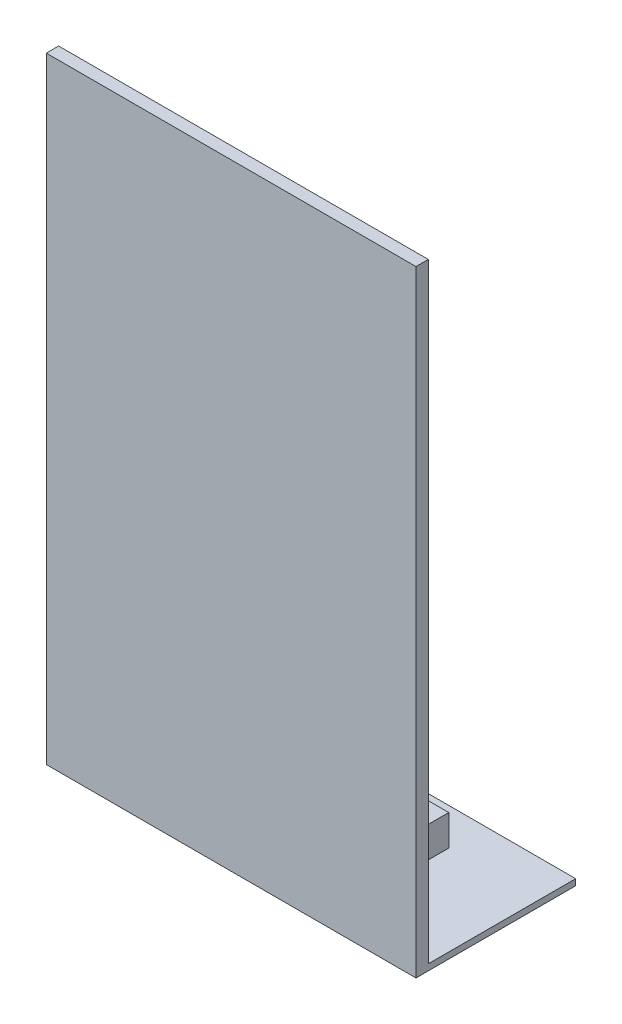
ISO-10303-21;
HEADER;
FILE_DESCRIPTION(('STEP AP214'),'2;1');
FILE_NAME('part.step','',(''),(''),'','','');
FILE_SCHEMA(('AUTOMOTIVE_DESIGN { 1 0 10303 214 1 1 1 1 }'));
ENDSEC;
DATA;
#1=APPLICATION_CONTEXT('core data for automotive mechanical design processes');
#2=APPLICATION_PROTOCOL_DEFINITION('international standard','automotive_design',2000,#1);
#3=PRODUCT_CONTEXT('',#1,'mechanical');
#4=PRODUCT('Part','Part','',(#3));
#5=PRODUCT_RELATED_PRODUCT_CATEGORY('part','',(#4));
#6=PRODUCT_DEFINITION_FORMATION('','',#4);
#7=PRODUCT_DEFINITION_CONTEXT('part definition',#1,'design');
#8=PRODUCT_DEFINITION('design','',#6,#7);
#9=PRODUCT_DEFINITION_SHAPE('','',#8);
#10=(LENGTH_UNIT() NAMED_UNIT(*) SI_UNIT(.MILLI.,.METRE.));
#11=(NAMED_UNIT(*) PLANE_ANGLE_UNIT() SI_UNIT($,.RADIAN.));
#12=(NAMED_UNIT(*) SI_UNIT($,.STERADIAN.) SOLID_ANGLE_UNIT());
#13=UNCERTAINTY_MEASURE_WITH_UNIT(LENGTH_MEASURE(1.E-05),#10,'distance_accuracy_value','');
#14=(GEOMETRIC_REPRESENTATION_CONTEXT(3) GLOBAL_UNCERTAINTY_ASSIGNED_CONTEXT((#13)) GLOBAL_UNIT_ASSIGNED_CONTEXT((#10,
#11,#12)) REPRESENTATION_CONTEXT('',''));
#15=CARTESIAN_POINT('',(0.,0.,0.));
#16=DIRECTION('',(0.,0.,1.));
#17=DIRECTION('',(1.,0.,0.));
#18=AXIS2_PLACEMENT_3D('',#15,#16,#17);
#19=CARTESIAN_POINT('',(0.,5.,0.));
#20=DIRECTION('',(0.,1.,0.));
#21=DIRECTION('',(0.,0.,1.));
#22=AXIS2_PLACEMENT_3D('',#19,#20,#21);
#23=PLANE('',#22);
#24=DIRECTION('',(0.,0.,1.));
#25=VECTOR('',#24,1.);
#26=CARTESIAN_POINT('',(-150.,5.,176.));
#27=LINE('',#26,#25);
#28=CARTESIAN_POINT('',(-150.,5.,176.));
#29=VERTEX_POINT('',#28);
#30=CARTESIAN_POINT('',(-150.,5.,295.6));
#31=VERTEX_POINT('',#30);
#32=EDGE_CURVE('E269',#29,#31,#27,.T.);
#33=ORIENTED_EDGE('',*,*,#32,.T.);
#34=DIRECTION('',(1.,0.,0.));
#35=VECTOR('',#34,1.);
#36=CARTESIAN_POINT('',(0.,5.,295.6));
#37=LINE('',#36,#35);
#38=CARTESIAN_POINT('',(150.,5.,295.6));
#39=VERTEX_POINT('',#38);
#40=EDGE_CURVE('E11',#31,#39,#37,.T.);
#41=ORIENTED_EDGE('',*,*,#40,.T.);
#42=DIRECTION('',(0.,0.,-1.));
#43=VECTOR('',#42,1.);
#44=CARTESIAN_POINT('',(150.,5.,176.));
#45=LINE('',#44,#43);
#46=CARTESIAN_POINT('',(150.,5.,176.));
#47=VERTEX_POINT('',#46);
#48=EDGE_CURVE('E272',#39,#47,#45,.T.);
#49=ORIENTED_EDGE('',*,*,#48,.T.);
#50=DIRECTION('',(-1.,0.,0.));
#51=VECTOR('',#50,1.);
#52=CARTESIAN_POINT('',(-150.,5.,176.));
#53=LINE('',#52,#51);
#54=EDGE_CURVE('E277',#47,#29,#53,.T.);
#55=ORIENTED_EDGE('',*,*,#54,.T.);
#56=EDGE_LOOP('',(#33,#41,#49,#55));
#57=FACE_BOUND('',#56,.T.);
#58=DIRECTION('',(-1.,0.,0.));
#59=VECTOR('',#58,1.);
#60=CARTESIAN_POINT('',(-51.,5.,206.));
#61=LINE('',#60,#59);
#62=CARTESIAN_POINT('',(-51.,5.,206.));
#63=VERTEX_POINT('',#62);
#64=CARTESIAN_POINT('',(-77.,5.,206.));
#65=VERTEX_POINT('',#64);
#66=EDGE_CURVE('E213',#63,#65,#61,.T.);
#67=ORIENTED_EDGE('',*,*,#66,.F.);
#68=DIRECTION('',(0.,0.,-1.));
#69=VECTOR('',#68,1.);
#70=CARTESIAN_POINT('',(-51.,5.,206.));
#71=LINE('',#70,#69);
#72=CARTESIAN_POINT('',(-51.,5.,226.));
#73=VERTEX_POINT('',#72);
#74=EDGE_CURVE('E214',#73,#63,#71,.T.);
#75=ORIENTED_EDGE('',*,*,#74,.F.);
#76=DIRECTION('',(1.,0.,0.));
#77=VECTOR('',#76,1.);
#78=CARTESIAN_POINT('',(-51.,5.,226.));
#79=LINE('',#78,#77);
#80=CARTESIAN_POINT('',(-77.,5.,226.));
#81=VERTEX_POINT('',#80);
#82=EDGE_CURVE('E208',#81,#73,#79,.T.);
#83=ORIENTED_EDGE('',*,*,#82,.F.);
#84=DIRECTION('',(0.,0.,1.));
#85=VECTOR('',#84,1.);
#86=CARTESIAN_POINT('',(-77.,5.,206.));
#87=LINE('',#86,#85);
#88=EDGE_CURVE('E209',#65,#81,#87,.T.);
#89=ORIENTED_EDGE('',*,*,#88,.F.);
#90=EDGE_LOOP('',(#67,#75,#83,#89));
#91=FACE_BOUND('',#90,.T.);
#92=DIRECTION('',(1.,0.,0.));
#93=VECTOR('',#92,1.);
#94=CARTESIAN_POINT('',(51.,5.,226.));
#95=LINE('',#94,#93);
#96=CARTESIAN_POINT('',(51.,5.,226.));
#97=VERTEX_POINT('',#96);
#98=CARTESIAN_POINT('',(77.,5.,226.));
#99=VERTEX_POINT('',#98);
#100=EDGE_CURVE('E538',#97,#99,#95,.T.);
#101=ORIENTED_EDGE('',*,*,#100,.F.);
#102=DIRECTION('',(0.,0.,1.));
#103=VECTOR('',#102,1.);
#104=CARTESIAN_POINT('',(51.,5.,206.));
#105=LINE('',#104,#103);
#106=CARTESIAN_POINT('',(51.,5.,206.));
#107=VERTEX_POINT('',#106);
#108=EDGE_CURVE('E186',#107,#97,#105,.T.);
#109=ORIENTED_EDGE('',*,*,#108,.F.);
#110=DIRECTION('',(-1.,0.,0.));
#111=VECTOR('',#110,1.);
#112=CARTESIAN_POINT('',(51.,5.,206.));
#113=LINE('',#112,#111);
#114=CARTESIAN_POINT('',(77.,5.,206.));
#115=VERTEX_POINT('',#114);
#116=EDGE_CURVE('E184',#115,#107,#113,.T.);
#117=ORIENTED_EDGE('',*,*,#116,.F.);
#118=DIRECTION('',(0.,0.,-1.));
#119=VECTOR('',#118,1.);
#120=CARTESIAN_POINT('',(77.,5.,206.));
#121=LINE('',#120,#119);
#122=EDGE_CURVE('E532',#99,#115,#121,.T.);
#123=ORIENTED_EDGE('',*,*,#122,.F.);
#124=EDGE_LOOP('',(#101,#109,#117,#123));
#125=FACE_BOUND('',#124,.T.);
#126=ADVANCED_FACE('F39',(#57,#91,#125),#23,.T.);
#127=CARTESIAN_POINT('',(-150.,5.,176.));
#128=DIRECTION('',(1.,0.,0.));
#129=DIRECTION('',(0.,0.,-1.));
#130=AXIS2_PLACEMENT_3D('',#127,#128,#129);
#131=PLANE('',#130);
#132=DIRECTION('',(0.,-1.,0.));
#133=VECTOR('',#132,1.);
#134=CARTESIAN_POINT('',(-150.,5.,305.6));
#135=LINE('',#134,#133);
#136=CARTESIAN_POINT('',(-150.,500.,305.6));
#137=VERTEX_POINT('',#136);
#138=CARTESIAN_POINT('',(-150.,0.,305.6));
#139=VERTEX_POINT('',#138);
#140=EDGE_CURVE('E50',#137,#139,#135,.T.);
#141=ORIENTED_EDGE('',*,*,#140,.F.);
#142=DIRECTION('',(0.,0.,1.));
#143=VECTOR('',#142,1.);
#144=CARTESIAN_POINT('',(-150.,500.,295.6));
#145=LINE('',#144,#143);
#146=CARTESIAN_POINT('',(-150.,500.,295.6));
#147=VERTEX_POINT('',#146);
#148=EDGE_CURVE('E249',#147,#137,#145,.T.);
#149=ORIENTED_EDGE('',*,*,#148,.F.);
#150=DIRECTION('',(0.,-1.,0.));
#151=VECTOR('',#150,1.);
#152=CARTESIAN_POINT('',(-150.,500.,295.6));
#153=LINE('',#152,#151);
#154=EDGE_CURVE('E262',#147,#31,#153,.T.);
#155=ORIENTED_EDGE('',*,*,#154,.T.);
#156=ORIENTED_EDGE('',*,*,#32,.F.);
#157=DIRECTION('',(0.,-1.,0.));
#158=VECTOR('',#157,1.);
#159=CARTESIAN_POINT('',(-150.,5.,176.));
#160=LINE('',#159,#158);
#161=CARTESIAN_POINT('',(-150.,0.,176.));
#162=VERTEX_POINT('',#161);
#163=EDGE_CURVE('E279',#29,#162,#160,.T.);
#164=ORIENTED_EDGE('',*,*,#163,.T.);
#165=DIRECTION('',(0.,0.,1.));
#166=VECTOR('',#165,1.);
#167=CARTESIAN_POINT('',(-150.,0.,176.));
#168=LINE('',#167,#166);
#169=EDGE_CURVE('E267',#162,#139,#168,.T.);
#170=ORIENTED_EDGE('',*,*,#169,.T.);
#171=EDGE_LOOP('',(#141,#149,#155,#156,#164,#170));
#172=FACE_BOUND('',#171,.T.);
#173=ADVANCED_FACE('F41',(#172),#131,.F.);
#174=CARTESIAN_POINT('',(-150.,5.,305.6));
#175=DIRECTION('',(0.,0.,-1.));
#176=DIRECTION('',(-1.,0.,0.));
#177=AXIS2_PLACEMENT_3D('',#174,#175,#176);
#178=PLANE('',#177);
#179=DIRECTION('',(1.,0.,0.));
#180=VECTOR('',#179,1.);
#181=CARTESIAN_POINT('',(-150.,0.,305.6));
#182=LINE('',#181,#180);
#183=CARTESIAN_POINT('',(150.,0.,305.6));
#184=VERTEX_POINT('',#183);
#185=EDGE_CURVE('E278',#139,#184,#182,.T.);
#186=ORIENTED_EDGE('',*,*,#185,.T.);
#187=DIRECTION('',(0.,-1.,0.));
#188=VECTOR('',#187,1.);
#189=CARTESIAN_POINT('',(150.,5.,305.6));
#190=LINE('',#189,#188);
#191=CARTESIAN_POINT('',(150.,500.,305.6));
#192=VERTEX_POINT('',#191);
#193=EDGE_CURVE('E290',#192,#184,#190,.T.);
#194=ORIENTED_EDGE('',*,*,#193,.F.);
#195=DIRECTION('',(1.,0.,0.));
#196=VECTOR('',#195,1.);
#197=CARTESIAN_POINT('',(-150.,500.,305.6));
#198=LINE('',#197,#196);
#199=EDGE_CURVE('E260',#137,#192,#198,.T.);
#200=ORIENTED_EDGE('',*,*,#199,.F.);
#201=ORIENTED_EDGE('',*,*,#140,.T.);
#202=EDGE_LOOP('',(#186,#194,#200,#201));
#203=FACE_BOUND('',#202,.T.);
#204=ADVANCED_FACE('F293',(#203),#178,.F.);
#205=CARTESIAN_POINT('',(150.,5.,176.));
#206=DIRECTION('',(-1.,0.,0.));
#207=DIRECTION('',(0.,0.,1.));
#208=AXIS2_PLACEMENT_3D('',#205,#206,#207);
#209=PLANE('',#208);
#210=ORIENTED_EDGE('',*,*,#48,.F.);
#211=DIRECTION('',(0.,-1.,0.));
#212=VECTOR('',#211,1.);
#213=CARTESIAN_POINT('',(150.,500.,295.6));
#214=LINE('',#213,#212);
#215=CARTESIAN_POINT('',(150.,500.,295.6));
#216=VERTEX_POINT('',#215);
#217=EDGE_CURVE('E270',#216,#39,#214,.T.);
#218=ORIENTED_EDGE('',*,*,#217,.F.);
#219=DIRECTION('',(0.,0.,-1.));
#220=VECTOR('',#219,1.);
#221=CARTESIAN_POINT('',(150.,500.,295.6));
#222=LINE('',#221,#220);
#223=EDGE_CURVE('E257',#192,#216,#222,.T.);
#224=ORIENTED_EDGE('',*,*,#223,.F.);
#225=ORIENTED_EDGE('',*,*,#193,.T.);
#226=DIRECTION('',(0.,0.,-1.));
#227=VECTOR('',#226,1.);
#228=CARTESIAN_POINT('',(150.,0.,176.));
#229=LINE('',#228,#227);
#230=CARTESIAN_POINT('',(150.,0.,176.));
#231=VERTEX_POINT('',#230);
#232=EDGE_CURVE('E285',#184,#231,#229,.T.);
#233=ORIENTED_EDGE('',*,*,#232,.T.);
#234=DIRECTION('',(0.,-1.,0.));
#235=VECTOR('',#234,1.);
#236=CARTESIAN_POINT('',(150.,5.,176.));
#237=LINE('',#236,#235);
#238=EDGE_CURVE('E287',#47,#231,#237,.T.);
#239=ORIENTED_EDGE('',*,*,#238,.F.);
#240=EDGE_LOOP('',(#210,#218,#224,#225,#233,#239));
#241=FACE_BOUND('',#240,.T.);
#242=ADVANCED_FACE('F310',(#241),#209,.F.);
#243=CARTESIAN_POINT('',(-150.,5.,176.));
#244=DIRECTION('',(0.,0.,1.));
#245=DIRECTION('',(1.,0.,0.));
#246=AXIS2_PLACEMENT_3D('',#243,#244,#245);
#247=PLANE('',#246);
#248=DIRECTION('',(-1.,0.,0.));
#249=VECTOR('',#248,1.);
#250=CARTESIAN_POINT('',(-150.,0.,176.));
#251=LINE('',#250,#249);
#252=EDGE_CURVE('E273',#231,#162,#251,.T.);
#253=ORIENTED_EDGE('',*,*,#252,.T.);
#254=ORIENTED_EDGE('',*,*,#163,.F.);
#255=ORIENTED_EDGE('',*,*,#54,.F.);
#256=ORIENTED_EDGE('',*,*,#238,.T.);
#257=EDGE_LOOP('',(#253,#254,#255,#256));
#258=FACE_BOUND('',#257,.T.);
#259=ADVANCED_FACE('F311',(#258),#247,.F.);
#260=CARTESIAN_POINT('',(0.,0.,0.));
#261=DIRECTION('',(0.,1.,0.));
#262=DIRECTION('',(0.,0.,1.));
#263=AXIS2_PLACEMENT_3D('',#260,#261,#262);
#264=PLANE('',#263);
#265=ORIENTED_EDGE('',*,*,#252,.F.);
#266=ORIENTED_EDGE('',*,*,#232,.F.);
#267=ORIENTED_EDGE('',*,*,#185,.F.);
#268=ORIENTED_EDGE('',*,*,#169,.F.);
#269=EDGE_LOOP('',(#265,#266,#267,#268));
#270=FACE_BOUND('',#269,.T.);
#271=ADVANCED_FACE('F305',(#270),#264,.F.);
#272=CARTESIAN_POINT('',(-150.,500.,295.6));
#273=DIRECTION('',(0.,0.,1.));
#274=DIRECTION('',(1.,0.,0.));
#275=AXIS2_PLACEMENT_3D('',#272,#273,#274);
#276=PLANE('',#275);
#277=DIRECTION('',(-1.,0.,0.));
#278=VECTOR('',#277,1.);
#279=CARTESIAN_POINT('',(-40.,440.,295.6));
#280=LINE('',#279,#278);
#281=CARTESIAN_POINT('',(40.,440.,295.6));
#282=VERTEX_POINT('',#281);
#283=CARTESIAN_POINT('',(-40.,440.,295.6));
#284=VERTEX_POINT('',#283);
#285=EDGE_CURVE('E227',#282,#284,#280,.T.);
#286=ORIENTED_EDGE('',*,*,#285,.T.);
#287=DIRECTION('',(0.,-1.,0.));
#288=VECTOR('',#287,1.);
#289=CARTESIAN_POINT('',(-40.,360.,295.6));
#290=LINE('',#289,#288);
#291=CARTESIAN_POINT('',(-40.,360.,295.6));
#292=VERTEX_POINT('',#291);
#293=EDGE_CURVE('E189',#284,#292,#290,.T.);
#294=ORIENTED_EDGE('',*,*,#293,.T.);
#295=DIRECTION('',(1.,0.,0.));
#296=VECTOR('',#295,1.);
#297=CARTESIAN_POINT('',(-40.,360.,295.6));
#298=LINE('',#297,#296);
#299=CARTESIAN_POINT('',(40.,360.,295.6));
#300=VERTEX_POINT('',#299);
#301=EDGE_CURVE('E194',#292,#300,#298,.T.);
#302=ORIENTED_EDGE('',*,*,#301,.T.);
#303=DIRECTION('',(0.,1.,0.));
#304=VECTOR('',#303,1.);
#305=CARTESIAN_POINT('',(40.,360.,295.6));
#306=LINE('',#305,#304);
#307=EDGE_CURVE('E243',#300,#282,#306,.T.);
#308=ORIENTED_EDGE('',*,*,#307,.T.);
#309=EDGE_LOOP('',(#286,#294,#302,#308));
#310=FACE_BOUND('',#309,.T.);
#311=ORIENTED_EDGE('',*,*,#40,.F.);
#312=ORIENTED_EDGE('',*,*,#154,.F.);
#313=DIRECTION('',(-1.,0.,0.));
#314=VECTOR('',#313,1.);
#315=CARTESIAN_POINT('',(-150.,500.,295.6));
#316=LINE('',#315,#314);
#317=EDGE_CURVE('E265',#216,#147,#316,.T.);
#318=ORIENTED_EDGE('',*,*,#317,.F.);
#319=ORIENTED_EDGE('',*,*,#217,.T.);
#320=EDGE_LOOP('',(#311,#312,#318,#319));
#321=FACE_BOUND('',#320,.T.);
#322=ADVANCED_FACE('F319',(#310,#321),#276,.F.);
#323=CARTESIAN_POINT('',(0.,500.,0.));
#324=DIRECTION('',(0.,1.,0.));
#325=DIRECTION('',(0.,0.,1.));
#326=AXIS2_PLACEMENT_3D('',#323,#324,#325);
#327=PLANE('',#326);
#328=ORIENTED_EDGE('',*,*,#148,.T.);
#329=ORIENTED_EDGE('',*,*,#199,.T.);
#330=ORIENTED_EDGE('',*,*,#223,.T.);
#331=ORIENTED_EDGE('',*,*,#317,.T.);
#332=EDGE_LOOP('',(#328,#329,#330,#331));
#333=FACE_BOUND('',#332,.T.);
#334=ADVANCED_FACE('F325',(#333),#327,.T.);
#335=CARTESIAN_POINT('',(-40.,360.,294.6));
#336=DIRECTION('',(-1.,0.,0.));
#337=DIRECTION('',(0.,0.,1.));
#338=AXIS2_PLACEMENT_3D('',#335,#336,#337);
#339=PLANE('',#338);
#340=ORIENTED_EDGE('',*,*,#293,.F.);
#341=DIRECTION('',(0.,0.,1.));
#342=VECTOR('',#341,1.);
#343=CARTESIAN_POINT('',(-40.,440.,294.6));
#344=LINE('',#343,#342);
#345=CARTESIAN_POINT('',(-40.,440.,294.6));
#346=VERTEX_POINT('',#345);
#347=EDGE_CURVE('E246',#346,#284,#344,.T.);
#348=ORIENTED_EDGE('',*,*,#347,.F.);
#349=DIRECTION('',(0.,-1.,0.));
#350=VECTOR('',#349,1.);
#351=CARTESIAN_POINT('',(-40.,360.,294.6));
#352=LINE('',#351,#350);
#353=CARTESIAN_POINT('',(-40.,360.,294.6));
#354=VERTEX_POINT('',#353);
#355=EDGE_CURVE('E223',#346,#354,#352,.T.);
#356=ORIENTED_EDGE('',*,*,#355,.T.);
#357=DIRECTION('',(0.,0.,1.));
#358=VECTOR('',#357,1.);
#359=CARTESIAN_POINT('',(-40.,360.,294.6));
#360=LINE('',#359,#358);
#361=EDGE_CURVE('E240',#354,#292,#360,.T.);
#362=ORIENTED_EDGE('',*,*,#361,.T.);
#363=EDGE_LOOP('',(#340,#348,#356,#362));
#364=FACE_BOUND('',#363,.T.);
#365=ADVANCED_FACE('F322',(#364),#339,.T.);
#366=CARTESIAN_POINT('',(-40.,440.,294.6));
#367=DIRECTION('',(0.,1.,0.));
#368=DIRECTION('',(0.,0.,1.));
#369=AXIS2_PLACEMENT_3D('',#366,#367,#368);
#370=PLANE('',#369);
#371=ORIENTED_EDGE('',*,*,#285,.F.);
#372=DIRECTION('',(0.,0.,1.));
#373=VECTOR('',#372,1.);
#374=CARTESIAN_POINT('',(40.,440.,294.6));
#375=LINE('',#374,#373);
#376=CARTESIAN_POINT('',(40.,440.,294.6));
#377=VERTEX_POINT('',#376);
#378=EDGE_CURVE('E248',#377,#282,#375,.T.);
#379=ORIENTED_EDGE('',*,*,#378,.F.);
#380=DIRECTION('',(-1.,0.,0.));
#381=VECTOR('',#380,1.);
#382=CARTESIAN_POINT('',(-40.,440.,294.6));
#383=LINE('',#382,#381);
#384=EDGE_CURVE('E235',#377,#346,#383,.T.);
#385=ORIENTED_EDGE('',*,*,#384,.T.);
#386=ORIENTED_EDGE('',*,*,#347,.T.);
#387=EDGE_LOOP('',(#371,#379,#385,#386));
#388=FACE_BOUND('',#387,.T.);
#389=ADVANCED_FACE('F332',(#388),#370,.T.);
#390=CARTESIAN_POINT('',(40.,360.,294.6));
#391=DIRECTION('',(1.,0.,0.));
#392=DIRECTION('',(0.,0.,-1.));
#393=AXIS2_PLACEMENT_3D('',#390,#391,#392);
#394=PLANE('',#393);
#395=ORIENTED_EDGE('',*,*,#307,.F.);
#396=DIRECTION('',(0.,0.,1.));
#397=VECTOR('',#396,1.);
#398=CARTESIAN_POINT('',(40.,360.,294.6));
#399=LINE('',#398,#397);
#400=CARTESIAN_POINT('',(40.,360.,294.6));
#401=VERTEX_POINT('',#400);
#402=EDGE_CURVE('E253',#401,#300,#399,.T.);
#403=ORIENTED_EDGE('',*,*,#402,.F.);
#404=DIRECTION('',(0.,1.,0.));
#405=VECTOR('',#404,1.);
#406=CARTESIAN_POINT('',(40.,360.,294.6));
#407=LINE('',#406,#405);
#408=EDGE_CURVE('E232',#401,#377,#407,.T.);
#409=ORIENTED_EDGE('',*,*,#408,.T.);
#410=ORIENTED_EDGE('',*,*,#378,.T.);
#411=EDGE_LOOP('',(#395,#403,#409,#410));
#412=FACE_BOUND('',#411,.T.);
#413=ADVANCED_FACE('F410',(#412),#394,.T.);
#414=CARTESIAN_POINT('',(-40.,360.,294.6));
#415=DIRECTION('',(0.,-1.,0.));
#416=DIRECTION('',(0.,0.,-1.));
#417=AXIS2_PLACEMENT_3D('',#414,#415,#416);
#418=PLANE('',#417);
#419=ORIENTED_EDGE('',*,*,#301,.F.);
#420=ORIENTED_EDGE('',*,*,#361,.F.);
#421=DIRECTION('',(1.,0.,0.));
#422=VECTOR('',#421,1.);
#423=CARTESIAN_POINT('',(-40.,360.,294.6));
#424=LINE('',#423,#422);
#425=EDGE_CURVE('E226',#354,#401,#424,.T.);
#426=ORIENTED_EDGE('',*,*,#425,.T.);
#427=ORIENTED_EDGE('',*,*,#402,.T.);
#428=EDGE_LOOP('',(#419,#420,#426,#427));
#429=FACE_BOUND('',#428,.T.);
#430=ADVANCED_FACE('F418',(#429),#418,.T.);
#431=CARTESIAN_POINT('',(0.,0.,294.6));
#432=DIRECTION('',(0.,0.,-1.));
#433=DIRECTION('',(-1.,0.,0.));
#434=AXIS2_PLACEMENT_3D('',#431,#432,#433);
#435=PLANE('',#434);
#436=ORIENTED_EDGE('',*,*,#355,.F.);
#437=ORIENTED_EDGE('',*,*,#384,.F.);
#438=ORIENTED_EDGE('',*,*,#408,.F.);
#439=ORIENTED_EDGE('',*,*,#425,.F.);
#440=EDGE_LOOP('',(#436,#437,#438,#439));
#441=FACE_BOUND('',#440,.T.);
#442=ADVANCED_FACE('F422',(#441),#435,.T.);
#443=CARTESIAN_POINT('',(-51.,30.,206.));
#444=DIRECTION('',(-1.,0.,0.));
#445=DIRECTION('',(0.,0.,1.));
#446=AXIS2_PLACEMENT_3D('',#443,#444,#445);
#447=PLANE('',#446);
#448=ORIENTED_EDGE('',*,*,#74,.T.);
#449=DIRECTION('',(0.,-1.,0.));
#450=VECTOR('',#449,1.);
#451=CARTESIAN_POINT('',(-51.,30.,206.));
#452=LINE('',#451,#450);
#453=CARTESIAN_POINT('',(-51.,30.,206.));
#454=VERTEX_POINT('',#453);
#455=EDGE_CURVE('E196',#454,#63,#452,.T.);
#456=ORIENTED_EDGE('',*,*,#455,.F.);
#457=DIRECTION('',(0.,0.,-1.));
#458=VECTOR('',#457,1.);
#459=CARTESIAN_POINT('',(-51.,30.,206.));
#460=LINE('',#459,#458);
#461=CARTESIAN_POINT('',(-51.,30.,226.));
#462=VERTEX_POINT('',#461);
#463=EDGE_CURVE('E211',#462,#454,#460,.T.);
#464=ORIENTED_EDGE('',*,*,#463,.F.);
#465=DIRECTION('',(0.,-1.,0.));
#466=VECTOR('',#465,1.);
#467=CARTESIAN_POINT('',(-51.,30.,226.));
#468=LINE('',#467,#466);
#469=EDGE_CURVE('E204',#462,#73,#468,.T.);
#470=ORIENTED_EDGE('',*,*,#469,.T.);
#471=EDGE_LOOP('',(#448,#456,#464,#470));
#472=FACE_BOUND('',#471,.T.);
#473=ADVANCED_FACE('F435',(#472),#447,.F.);
#474=CARTESIAN_POINT('',(-51.,30.,206.));
#475=DIRECTION('',(0.,0.,1.));
#476=DIRECTION('',(1.,0.,0.));
#477=AXIS2_PLACEMENT_3D('',#474,#475,#476);
#478=PLANE('',#477);
#479=ORIENTED_EDGE('',*,*,#66,.T.);
#480=DIRECTION('',(0.,-1.,0.));
#481=VECTOR('',#480,1.);
#482=CARTESIAN_POINT('',(-77.,30.,206.));
#483=LINE('',#482,#481);
#484=CARTESIAN_POINT('',(-77.,30.,206.));
#485=VERTEX_POINT('',#484);
#486=EDGE_CURVE('E199',#485,#65,#483,.T.);
#487=ORIENTED_EDGE('',*,*,#486,.F.);
#488=DIRECTION('',(-1.,0.,0.));
#489=VECTOR('',#488,1.);
#490=CARTESIAN_POINT('',(-51.,30.,206.));
#491=LINE('',#490,#489);
#492=EDGE_CURVE('E222',#454,#485,#491,.T.);
#493=ORIENTED_EDGE('',*,*,#492,.F.);
#494=ORIENTED_EDGE('',*,*,#455,.T.);
#495=EDGE_LOOP('',(#479,#487,#493,#494));
#496=FACE_BOUND('',#495,.T.);
#497=ADVANCED_FACE('F443',(#496),#478,.F.);
#498=CARTESIAN_POINT('',(-77.,30.,206.));
#499=DIRECTION('',(1.,0.,0.));
#500=DIRECTION('',(0.,0.,-1.));
#501=AXIS2_PLACEMENT_3D('',#498,#499,#500);
#502=PLANE('',#501);
#503=ORIENTED_EDGE('',*,*,#88,.T.);
#504=DIRECTION('',(0.,-1.,0.));
#505=VECTOR('',#504,1.);
#506=CARTESIAN_POINT('',(-77.,30.,226.));
#507=LINE('',#506,#505);
#508=CARTESIAN_POINT('',(-77.,30.,226.));
#509=VERTEX_POINT('',#508);
#510=EDGE_CURVE('E65',#509,#81,#507,.T.);
#511=ORIENTED_EDGE('',*,*,#510,.F.);
#512=DIRECTION('',(0.,0.,1.));
#513=VECTOR('',#512,1.);
#514=CARTESIAN_POINT('',(-77.,30.,206.));
#515=LINE('',#514,#513);
#516=EDGE_CURVE('E218',#485,#509,#515,.T.);
#517=ORIENTED_EDGE('',*,*,#516,.F.);
#518=ORIENTED_EDGE('',*,*,#486,.T.);
#519=EDGE_LOOP('',(#503,#511,#517,#518));
#520=FACE_BOUND('',#519,.T.);
#521=ADVANCED_FACE('F453',(#520),#502,.F.);
#522=CARTESIAN_POINT('',(-51.,30.,226.));
#523=DIRECTION('',(0.,0.,-1.));
#524=DIRECTION('',(-1.,0.,0.));
#525=AXIS2_PLACEMENT_3D('',#522,#523,#524);
#526=PLANE('',#525);
#527=ORIENTED_EDGE('',*,*,#82,.T.);
#528=ORIENTED_EDGE('',*,*,#469,.F.);
#529=DIRECTION('',(1.,0.,0.));
#530=VECTOR('',#529,1.);
#531=CARTESIAN_POINT('',(-51.,30.,226.));
#532=LINE('',#531,#530);
#533=EDGE_CURVE('E210',#509,#462,#532,.T.);
#534=ORIENTED_EDGE('',*,*,#533,.F.);
#535=ORIENTED_EDGE('',*,*,#510,.T.);
#536=EDGE_LOOP('',(#527,#528,#534,#535));
#537=FACE_BOUND('',#536,.T.);
#538=ADVANCED_FACE('F461',(#537),#526,.F.);
#539=CARTESIAN_POINT('',(0.,30.,0.));
#540=DIRECTION('',(0.,-1.,0.));
#541=DIRECTION('',(0.,0.,-1.));
#542=AXIS2_PLACEMENT_3D('',#539,#540,#541);
#543=PLANE('',#542);
#544=ORIENTED_EDGE('',*,*,#463,.T.);
#545=ORIENTED_EDGE('',*,*,#492,.T.);
#546=ORIENTED_EDGE('',*,*,#516,.T.);
#547=ORIENTED_EDGE('',*,*,#533,.T.);
#548=EDGE_LOOP('',(#544,#545,#546,#547));
#549=FACE_BOUND('',#548,.T.);
#550=ADVANCED_FACE('F472',(#549),#543,.F.);
#551=CARTESIAN_POINT('',(51.,30.,206.));
#552=DIRECTION('',(1.,0.,0.));
#553=DIRECTION('',(0.,0.,-1.));
#554=AXIS2_PLACEMENT_3D('',#551,#552,#553);
#555=PLANE('',#554);
#556=ORIENTED_EDGE('',*,*,#108,.T.);
#557=DIRECTION('',(0.,-1.,0.));
#558=VECTOR('',#557,1.);
#559=CARTESIAN_POINT('',(51.,30.,226.));
#560=LINE('',#559,#558);
#561=CARTESIAN_POINT('',(51.,30.,226.));
#562=VERTEX_POINT('',#561);
#563=EDGE_CURVE('E166',#562,#97,#560,.T.);
#564=ORIENTED_EDGE('',*,*,#563,.F.);
#565=DIRECTION('',(0.,0.,1.));
#566=VECTOR('',#565,1.);
#567=CARTESIAN_POINT('',(51.,30.,206.));
#568=LINE('',#567,#566);
#569=CARTESIAN_POINT('',(51.,30.,206.));
#570=VERTEX_POINT('',#569);
#571=EDGE_CURVE('E176',#570,#562,#568,.T.);
#572=ORIENTED_EDGE('',*,*,#571,.F.);
#573=DIRECTION('',(0.,-1.,0.));
#574=VECTOR('',#573,1.);
#575=CARTESIAN_POINT('',(51.,30.,206.));
#576=LINE('',#575,#574);
#577=EDGE_CURVE('E535',#570,#107,#576,.T.);
#578=ORIENTED_EDGE('',*,*,#577,.T.);
#579=EDGE_LOOP('',(#556,#564,#572,#578));
#580=FACE_BOUND('',#579,.T.);
#581=ADVANCED_FACE('F188',(#580),#555,.F.);
#582=CARTESIAN_POINT('',(51.,30.,226.));
#583=DIRECTION('',(0.,0.,-1.));
#584=DIRECTION('',(-1.,0.,0.));
#585=AXIS2_PLACEMENT_3D('',#582,#583,#584);
#586=PLANE('',#585);
#587=ORIENTED_EDGE('',*,*,#100,.T.);
#588=DIRECTION('',(0.,-1.,0.));
#589=VECTOR('',#588,1.);
#590=CARTESIAN_POINT('',(77.,30.,226.));
#591=LINE('',#590,#589);
#592=CARTESIAN_POINT('',(77.,30.,226.));
#593=VERTEX_POINT('',#592);
#594=EDGE_CURVE('E175',#593,#99,#591,.T.);
#595=ORIENTED_EDGE('',*,*,#594,.F.);
#596=DIRECTION('',(1.,0.,0.));
#597=VECTOR('',#596,1.);
#598=CARTESIAN_POINT('',(51.,30.,226.));
#599=LINE('',#598,#597);
#600=EDGE_CURVE('E164',#562,#593,#599,.T.);
#601=ORIENTED_EDGE('',*,*,#600,.F.);
#602=ORIENTED_EDGE('',*,*,#563,.T.);
#603=EDGE_LOOP('',(#587,#595,#601,#602));
#604=FACE_BOUND('',#603,.T.);
#605=ADVANCED_FACE('F170',(#604),#586,.F.);
#606=CARTESIAN_POINT('',(77.,30.,206.));
#607=DIRECTION('',(-1.,0.,0.));
#608=DIRECTION('',(0.,0.,1.));
#609=AXIS2_PLACEMENT_3D('',#606,#607,#608);
#610=PLANE('',#609);
#611=ORIENTED_EDGE('',*,*,#122,.T.);
#612=DIRECTION('',(0.,-1.,0.));
#613=VECTOR('',#612,1.);
#614=CARTESIAN_POINT('',(77.,30.,206.));
#615=LINE('',#614,#613);
#616=CARTESIAN_POINT('',(77.,30.,206.));
#617=VERTEX_POINT('',#616);
#618=EDGE_CURVE('E53',#617,#115,#615,.T.);
#619=ORIENTED_EDGE('',*,*,#618,.F.);
#620=DIRECTION('',(0.,0.,-1.));
#621=VECTOR('',#620,1.);
#622=CARTESIAN_POINT('',(77.,30.,206.));
#623=LINE('',#622,#621);
#624=EDGE_CURVE('E174',#593,#617,#623,.T.);
#625=ORIENTED_EDGE('',*,*,#624,.F.);
#626=ORIENTED_EDGE('',*,*,#594,.T.);
#627=EDGE_LOOP('',(#611,#619,#625,#626));
#628=FACE_BOUND('',#627,.T.);
#629=ADVANCED_FACE('F494',(#628),#610,.F.);
#630=CARTESIAN_POINT('',(51.,30.,206.));
#631=DIRECTION('',(0.,0.,1.));
#632=DIRECTION('',(1.,0.,0.));
#633=AXIS2_PLACEMENT_3D('',#630,#631,#632);
#634=PLANE('',#633);
#635=ORIENTED_EDGE('',*,*,#116,.T.);
#636=ORIENTED_EDGE('',*,*,#577,.F.);
#637=DIRECTION('',(-1.,0.,0.));
#638=VECTOR('',#637,1.);
#639=CARTESIAN_POINT('',(51.,30.,206.));
#640=LINE('',#639,#638);
#641=EDGE_CURVE('E180',#617,#570,#640,.T.);
#642=ORIENTED_EDGE('',*,*,#641,.F.);
#643=ORIENTED_EDGE('',*,*,#618,.T.);
#644=EDGE_LOOP('',(#635,#636,#642,#643));
#645=FACE_BOUND('',#644,.T.);
#646=ADVANCED_FACE('F501',(#645),#634,.F.);
#647=CARTESIAN_POINT('',(0.,30.,0.));
#648=DIRECTION('',(0.,1.,0.));
#649=DIRECTION('',(0.,0.,1.));
#650=AXIS2_PLACEMENT_3D('',#647,#648,#649);
#651=PLANE('',#650);
#652=ORIENTED_EDGE('',*,*,#571,.T.);
#653=ORIENTED_EDGE('',*,*,#600,.T.);
#654=ORIENTED_EDGE('',*,*,#624,.T.);
#655=ORIENTED_EDGE('',*,*,#641,.T.);
#656=EDGE_LOOP('',(#652,#653,#654,#655));
#657=FACE_BOUND('',#656,.T.);
#658=ADVANCED_FACE('F178',(#657),#651,.T.);
#659=CLOSED_SHELL('',(#126,#173,#204,#242,#259,#271,#322,#334,#365,#389,#413,#430,#442,#473,
#497,#521,#538,#550,#581,#605,#629,#646,#658));
#660=MANIFOLD_SOLID_BREP('B2',#659);
#661=ADVANCED_BREP_SHAPE_REPRESENTATION('',(#18,#660),#14);
#662=SHAPE_DEFINITION_REPRESENTATION(#9,#661);
ENDSEC;
END-ISO-10303-21;
